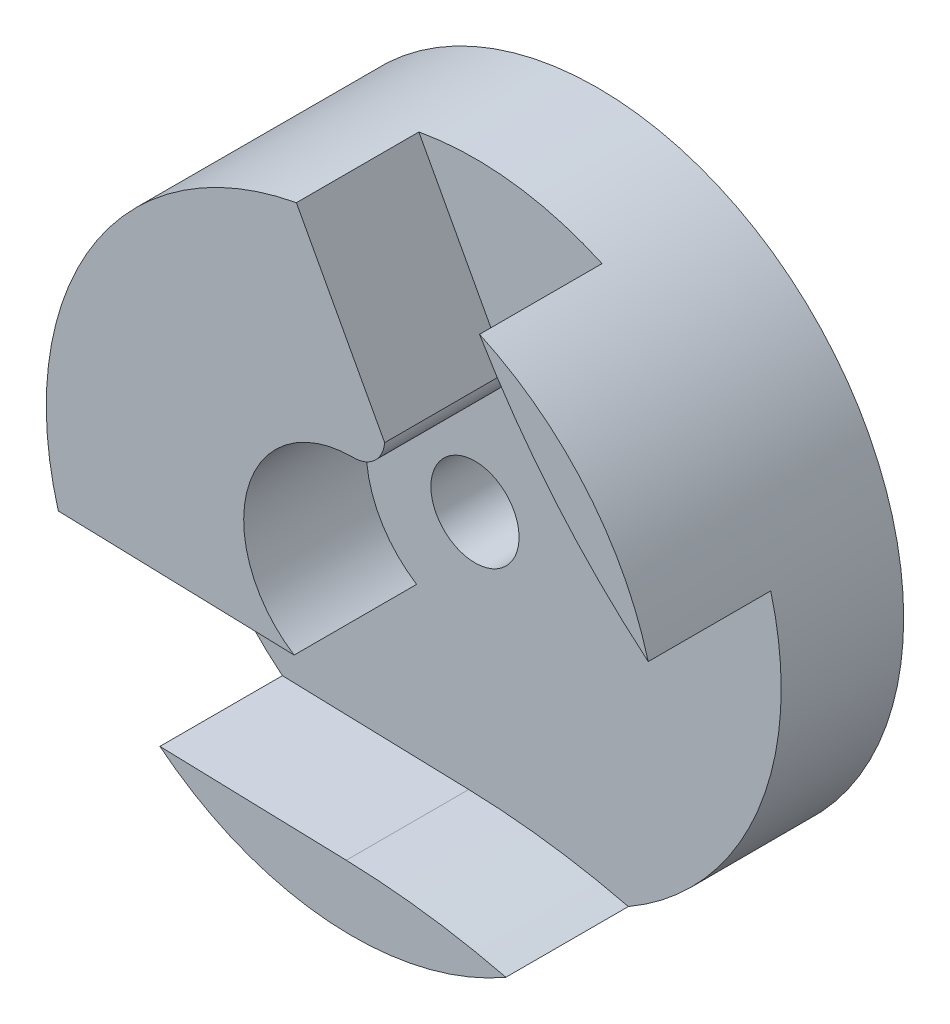
ISO-10303-21;
HEADER;
FILE_DESCRIPTION(('STEP AP214'),'2;1');
FILE_NAME('part.step','',(''),(''),'','','');
FILE_SCHEMA(('AUTOMOTIVE_DESIGN { 1 0 10303 214 1 1 1 1 }'));
ENDSEC;
DATA;
#1=APPLICATION_CONTEXT('core data for automotive mechanical design processes');
#2=APPLICATION_PROTOCOL_DEFINITION('international standard','automotive_design',2000,#1);
#3=PRODUCT_CONTEXT('',#1,'mechanical');
#4=PRODUCT('Part','Part','',(#3));
#5=PRODUCT_RELATED_PRODUCT_CATEGORY('part','',(#4));
#6=PRODUCT_DEFINITION_FORMATION('','',#4);
#7=PRODUCT_DEFINITION_CONTEXT('part definition',#1,'design');
#8=PRODUCT_DEFINITION('design','',#6,#7);
#9=PRODUCT_DEFINITION_SHAPE('','',#8);
#10=(LENGTH_UNIT() NAMED_UNIT(*) SI_UNIT(.MILLI.,.METRE.));
#11=(NAMED_UNIT(*) PLANE_ANGLE_UNIT() SI_UNIT($,.RADIAN.));
#12=(NAMED_UNIT(*) SI_UNIT($,.STERADIAN.) SOLID_ANGLE_UNIT());
#13=UNCERTAINTY_MEASURE_WITH_UNIT(LENGTH_MEASURE(1.E-05),#10,'distance_accuracy_value','');
#14=(GEOMETRIC_REPRESENTATION_CONTEXT(3) GLOBAL_UNCERTAINTY_ASSIGNED_CONTEXT((#13)) GLOBAL_UNIT_ASSIGNED_CONTEXT((#10,
#11,#12)) REPRESENTATION_CONTEXT('',''));
#15=CARTESIAN_POINT('',(0.,0.,0.));
#16=DIRECTION('',(0.,0.,1.));
#17=DIRECTION('',(1.,0.,0.));
#18=AXIS2_PLACEMENT_3D('',#15,#16,#17);
#19=CARTESIAN_POINT('',(-0.424832658778679,-9.62119595117413E-11,6.));
#20=DIRECTION('',(0.,0.,1.));
#21=DIRECTION('',(1.,0.,0.));
#22=AXIS2_PLACEMENT_3D('',#19,#20,#21);
#23=PLANE('',#22);
#24=CARTESIAN_POINT('',(-0.424832658778679,-9.62119595117413E-11,6.));
#25=DIRECTION('',(0.,0.,-1.));
#26=DIRECTION('',(-1.,0.,0.));
#27=AXIS2_PLACEMENT_3D('',#24,#25,#26);
#28=CIRCLE('',#27,2.15900000001489);
#29=CARTESIAN_POINT('',(-2.58383265879357,-9.62119595117413E-11,6.));
#30=VERTEX_POINT('',#29);
#31=EDGE_CURVE('E219',#30,#30,#28,.T.);
#32=ORIENTED_EDGE('',*,*,#31,.T.);
#33=EDGE_LOOP('',(#32));
#34=FACE_BOUND('',#33,.T.);
#35=DIRECTION('',(0.999579707189387,-0.0289898081259671,0.));
#36=VECTOR('',#35,1.);
#37=CARTESIAN_POINT('',(-0.346205444125785,-11.9372965479081,6.));
#38=LINE('',#37,#36);
#39=CARTESIAN_POINT('',(-9.85944441264087,-11.6613936155355,6.));
#40=VERTEX_POINT('',#39);
#41=CARTESIAN_POINT('',(-0.730311074451631,-11.9261567173942,6.));
#42=VERTEX_POINT('',#41);
#43=EDGE_CURVE('E60',#40,#42,#38,.T.);
#44=ORIENTED_EDGE('',*,*,#43,.T.);
#45=CARTESIAN_POINT('',(-1.82032785998803,-49.5103537077151,6.));
#46=DIRECTION('',(0.,0.,1.));
#47=DIRECTION('',(1.,0.,0.));
#48=AXIS2_PLACEMENT_3D('',#45,#46,#47);
#49=CIRCLE('',#48,37.6);
#50=CARTESIAN_POINT('',(7.09052015175933,-12.9815050027321,6.));
#51=VERTEX_POINT('',#50);
#52=EDGE_CURVE('E238',#51,#42,#49,.T.);
#53=ORIENTED_EDGE('',*,*,#52,.F.);
#54=CARTESIAN_POINT('',(-0.424832658778679,-9.62119595117413E-11,6.));
#55=DIRECTION('',(0.,0.,1.));
#56=DIRECTION('',(1.,0.,0.));
#57=AXIS2_PLACEMENT_3D('',#54,#55,#56);
#58=CIRCLE('',#57,15.0000000000107);
#59=CARTESIAN_POINT('',(14.0606908316208,3.8948182510428,6.));
#60=VERTEX_POINT('',#59);
#61=EDGE_CURVE('E53',#51,#60,#58,.T.);
#62=ORIENTED_EDGE('',*,*,#61,.T.);
#63=CARTESIAN_POINT('',(38.2023029240992,32.7208926555867,6.));
#64=DIRECTION('',(0.,0.,1.));
#65=DIRECTION('',(1.,0.,0.));
#66=AXIS2_PLACEMENT_3D('',#63,#64,#65);
#67=CIRCLE('',#66,37.6);
#68=CARTESIAN_POINT('',(5.79889159514122,13.6479030040833,6.));
#69=VERTEX_POINT('',#68);
#70=EDGE_CURVE('E143',#69,#60,#67,.T.);
#71=ORIENTED_EDGE('',*,*,#70,.F.);
#72=CARTESIAN_POINT('',(-3.17395166736761,14.7459263755825,6.));
#73=VERTEX_POINT('',#72);
#74=EDGE_CURVE('E54',#69,#73,#58,.T.);
#75=ORIENTED_EDGE('',*,*,#74,.T.);
#76=DIRECTION('',(0.474683943305985,-0.880156323596826,0.));
#77=VECTOR('',#76,1.);
#78=CARTESIAN_POINT('',(3.70200865666334,1.9965590431897,6.));
#79=LINE('',#78,#77);
#80=CARTESIAN_POINT('',(1.15065730337769,6.72726051093276,6.));
#81=VERTEX_POINT('',#80);
#82=EDGE_CURVE('E194',#73,#81,#79,.T.);
#83=ORIENTED_EDGE('',*,*,#82,.T.);
#84=CARTESIAN_POINT('',(-0.371756847908193,6.85779461302179,6.));
#85=DIRECTION('',(0.,0.,1.));
#86=DIRECTION('',(1.,0.,0.));
#87=AXIS2_PLACEMENT_3D('',#84,#85,#86);
#88=CIRCLE('',#87,1.52799999994885);
#89=CARTESIAN_POINT('',(-0.383582429555104,5.32984037435419,6.));
#90=VERTEX_POINT('',#89);
#91=EDGE_CURVE('E190',#90,#81,#88,.T.);
#92=ORIENTED_EDGE('',*,*,#91,.F.);
#93=CARTESIAN_POINT('',(-0.424832658730439,-9.62119595117413E-11,6.));
#94=DIRECTION('',(0.,0.,1.));
#95=DIRECTION('',(1.,0.,0.));
#96=AXIS2_PLACEMENT_3D('',#93,#94,#95);
#97=CIRCLE('',#96,5.32999999986197);
#98=CARTESIAN_POINT('',(-3.28272132782271,-4.49904127058963,6.));
#99=VERTEX_POINT('',#98);
#100=EDGE_CURVE('E167',#90,#99,#97,.T.);
#101=ORIENTED_EDGE('',*,*,#100,.T.);
#102=DIRECTION('',(-0.999579707189526,0.02898980812115,0.));
#103=VECTOR('',#102,1.);
#104=CARTESIAN_POINT('',(-0.133130354375202,-4.59038569997693,6.));
#105=LINE('',#104,#103);
#106=CARTESIAN_POINT('',(-14.8352856491735,-4.1639938295758,6.));
#107=VERTEX_POINT('',#106);
#108=EDGE_CURVE('E173',#99,#107,#105,.T.);
#109=ORIENTED_EDGE('',*,*,#108,.T.);
#110=EDGE_CURVE('E11',#107,#40,#58,.T.);
#111=ORIENTED_EDGE('',*,*,#110,.T.);
#112=EDGE_LOOP('',(#44,#53,#62,#71,#75,#83,#92,#101,#109,#111));
#113=FACE_BOUND('',#112,.T.);
#114=ADVANCED_FACE('F43',(#34,#113),#23,.T.);
#115=CARTESIAN_POINT('',(-0.424832658778679,-9.62119595117413E-11,6.));
#116=DIRECTION('',(0.,0.,-1.));
#117=DIRECTION('',(-1.,0.,0.));
#118=AXIS2_PLACEMENT_3D('',#115,#116,#117);
#119=CYLINDRICAL_SURFACE('',#118,15.0000000000107);
#120=ORIENTED_EDGE('',*,*,#110,.F.);
#121=DIRECTION('',(0.,0.,-1.));
#122=VECTOR('',#121,1.);
#123=CARTESIAN_POINT('',(-14.8352856491735,-4.1639938295758,12.));
#124=LINE('',#123,#122);
#125=CARTESIAN_POINT('',(-14.8352856491735,-4.1639938295758,12.));
#126=VERTEX_POINT('',#125);
#127=EDGE_CURVE('E202',#126,#107,#124,.T.);
#128=ORIENTED_EDGE('',*,*,#127,.F.);
#129=CARTESIAN_POINT('',(-0.424832658778679,-9.62119595117413E-11,12.));
#130=DIRECTION('',(0.,0.,1.));
#131=DIRECTION('',(1.,0.,0.));
#132=AXIS2_PLACEMENT_3D('',#129,#130,#131);
#133=CIRCLE('',#132,15.0000000000107);
#134=CARTESIAN_POINT('',(-3.17395166736761,14.7459263755825,12.));
#135=VERTEX_POINT('',#134);
#136=EDGE_CURVE('E180',#135,#126,#133,.T.);
#137=ORIENTED_EDGE('',*,*,#136,.F.);
#138=DIRECTION('',(0.,0.,-1.));
#139=VECTOR('',#138,1.);
#140=CARTESIAN_POINT('',(-3.17395166736761,14.7459263755825,12.));
#141=LINE('',#140,#139);
#142=EDGE_CURVE('E206',#135,#73,#141,.T.);
#143=ORIENTED_EDGE('',*,*,#142,.T.);
#144=ORIENTED_EDGE('',*,*,#74,.F.);
#145=DIRECTION('',(0.,0.,-1.));
#146=VECTOR('',#145,1.);
#147=CARTESIAN_POINT('',(5.79889159514122,13.6479030040833,12.));
#148=LINE('',#147,#146);
#149=CARTESIAN_POINT('',(5.79889159514122,13.6479030040833,12.));
#150=VERTEX_POINT('',#149);
#151=EDGE_CURVE('E163',#150,#69,#148,.T.);
#152=ORIENTED_EDGE('',*,*,#151,.F.);
#153=CARTESIAN_POINT('',(-0.424832658778679,-9.62119595117413E-11,12.));
#154=DIRECTION('',(0.,0.,1.));
#155=DIRECTION('',(1.,0.,0.));
#156=AXIS2_PLACEMENT_3D('',#153,#154,#155);
#157=CIRCLE('',#156,15.0000000000107);
#158=CARTESIAN_POINT('',(14.0606908316208,3.8948182510428,12.));
#159=VERTEX_POINT('',#158);
#160=EDGE_CURVE('E148',#159,#150,#157,.T.);
#161=ORIENTED_EDGE('',*,*,#160,.F.);
#162=DIRECTION('',(0.,0.,-1.));
#163=VECTOR('',#162,1.);
#164=CARTESIAN_POINT('',(14.0606908316208,3.8948182510428,12.));
#165=LINE('',#164,#163);
#166=EDGE_CURVE('E159',#159,#60,#165,.T.);
#167=ORIENTED_EDGE('',*,*,#166,.T.);
#168=ORIENTED_EDGE('',*,*,#61,.F.);
#169=DIRECTION('',(0.,0.,-1.));
#170=VECTOR('',#169,1.);
#171=CARTESIAN_POINT('',(7.09052015175933,-12.9815050027321,12.));
#172=LINE('',#171,#170);
#173=CARTESIAN_POINT('',(7.09052015175933,-12.9815050027321,12.));
#174=VERTEX_POINT('',#173);
#175=EDGE_CURVE('E126',#174,#51,#172,.T.);
#176=ORIENTED_EDGE('',*,*,#175,.F.);
#177=CARTESIAN_POINT('',(-0.424832658778679,-9.62119595117413E-11,12.));
#178=DIRECTION('',(0.,0.,1.));
#179=DIRECTION('',(1.,0.,0.));
#180=AXIS2_PLACEMENT_3D('',#177,#178,#179);
#181=CIRCLE('',#180,15.0000000000107);
#182=CARTESIAN_POINT('',(-9.85944441264088,-11.6613936155355,12.));
#183=VERTEX_POINT('',#182);
#184=EDGE_CURVE('E133',#183,#174,#181,.T.);
#185=ORIENTED_EDGE('',*,*,#184,.F.);
#186=DIRECTION('',(0.,0.,-1.));
#187=VECTOR('',#186,1.);
#188=CARTESIAN_POINT('',(-9.85944441264088,-11.6613936155355,12.));
#189=LINE('',#188,#187);
#190=EDGE_CURVE('E150',#183,#40,#189,.T.);
#191=ORIENTED_EDGE('',*,*,#190,.T.);
#192=EDGE_LOOP('',(#120,#128,#137,#143,#144,#152,#161,#167,#168,#176,#185,#191));
#193=FACE_BOUND('',#192,.T.);
#194=CARTESIAN_POINT('',(-0.424832658778679,-9.62119595117413E-11,0.));
#195=DIRECTION('',(0.,0.,1.));
#196=DIRECTION('',(1.,0.,0.));
#197=AXIS2_PLACEMENT_3D('',#194,#195,#196);
#198=CIRCLE('',#197,15.0000000000107);
#199=CARTESIAN_POINT('',(14.575167341232,-9.62119595117413E-11,0.));
#200=VERTEX_POINT('',#199);
#201=EDGE_CURVE('E47',#200,#200,#198,.T.);
#202=ORIENTED_EDGE('',*,*,#201,.T.);
#203=EDGE_LOOP('',(#202));
#204=FACE_BOUND('',#203,.T.);
#205=ADVANCED_FACE('F45',(#193,#204),#119,.T.);
#206=CARTESIAN_POINT('',(-0.424832658778679,-9.62119595117413E-11,0.));
#207=DIRECTION('',(0.,0.,1.));
#208=DIRECTION('',(1.,0.,0.));
#209=AXIS2_PLACEMENT_3D('',#206,#207,#208);
#210=PLANE('',#209);
#211=CARTESIAN_POINT('',(-0.424832658778679,-9.62119595117413E-11,0.));
#212=DIRECTION('',(0.,0.,-1.));
#213=DIRECTION('',(-1.,0.,0.));
#214=AXIS2_PLACEMENT_3D('',#211,#212,#213);
#215=CIRCLE('',#214,2.15900000001489);
#216=CARTESIAN_POINT('',(-2.58383265879357,-9.62119595117413E-11,0.));
#217=VERTEX_POINT('',#216);
#218=EDGE_CURVE('E218',#217,#217,#215,.T.);
#219=ORIENTED_EDGE('',*,*,#218,.F.);
#220=EDGE_LOOP('',(#219));
#221=FACE_BOUND('',#220,.T.);
#222=ORIENTED_EDGE('',*,*,#201,.F.);
#223=EDGE_LOOP('',(#222));
#224=FACE_BOUND('',#223,.T.);
#225=ADVANCED_FACE('F229',(#221,#224),#210,.F.);
#226=CARTESIAN_POINT('',(-0.424832658778679,-9.62119595117413E-11,6.));
#227=DIRECTION('',(0.,0.,-1.));
#228=DIRECTION('',(-1.,0.,0.));
#229=AXIS2_PLACEMENT_3D('',#226,#227,#228);
#230=CYLINDRICAL_SURFACE('',#229,2.15900000001489);
#231=ORIENTED_EDGE('',*,*,#31,.F.);
#232=EDGE_LOOP('',(#231));
#233=FACE_BOUND('',#232,.T.);
#234=ORIENTED_EDGE('',*,*,#218,.T.);
#235=EDGE_LOOP('',(#234));
#236=FACE_BOUND('',#235,.T.);
#237=ADVANCED_FACE('F227',(#233,#236),#230,.F.);
#238=CARTESIAN_POINT('',(-0.424832658730439,-9.62119595117413E-11,12.));
#239=DIRECTION('',(0.,0.,-1.));
#240=DIRECTION('',(-1.,0.,0.));
#241=AXIS2_PLACEMENT_3D('',#238,#239,#240);
#242=CYLINDRICAL_SURFACE('',#241,5.32999999986197);
#243=ORIENTED_EDGE('',*,*,#100,.F.);
#244=DIRECTION('',(0.,0.,-1.));
#245=VECTOR('',#244,1.);
#246=CARTESIAN_POINT('',(-0.383582429555104,5.32984037435419,12.));
#247=LINE('',#246,#245);
#248=CARTESIAN_POINT('',(-0.383582429555104,5.32984037435419,12.));
#249=VERTEX_POINT('',#248);
#250=EDGE_CURVE('E214',#249,#90,#247,.T.);
#251=ORIENTED_EDGE('',*,*,#250,.F.);
#252=CARTESIAN_POINT('',(-0.424832658730439,-9.62119595117413E-11,12.));
#253=DIRECTION('',(0.,0.,1.));
#254=DIRECTION('',(1.,0.,0.));
#255=AXIS2_PLACEMENT_3D('',#252,#253,#254);
#256=CIRCLE('',#255,5.32999999986197);
#257=CARTESIAN_POINT('',(-3.28272132782271,-4.49904127058963,12.));
#258=VERTEX_POINT('',#257);
#259=EDGE_CURVE('E168',#249,#258,#256,.T.);
#260=ORIENTED_EDGE('',*,*,#259,.T.);
#261=DIRECTION('',(0.,0.,-1.));
#262=VECTOR('',#261,1.);
#263=CARTESIAN_POINT('',(-3.28272132782271,-4.49904127058963,12.));
#264=LINE('',#263,#262);
#265=EDGE_CURVE('E187',#258,#99,#264,.T.);
#266=ORIENTED_EDGE('',*,*,#265,.T.);
#267=EDGE_LOOP('',(#243,#251,#260,#266));
#268=FACE_BOUND('',#267,.T.);
#269=ADVANCED_FACE('F265',(#268),#242,.F.);
#270=CARTESIAN_POINT('',(-0.371756847908193,6.85779461302179,12.));
#271=DIRECTION('',(0.,0.,-1.));
#272=DIRECTION('',(-1.,0.,0.));
#273=AXIS2_PLACEMENT_3D('',#270,#271,#272);
#274=CYLINDRICAL_SURFACE('',#273,1.52799999994885);
#275=ORIENTED_EDGE('',*,*,#91,.T.);
#276=DIRECTION('',(0.,0.,-1.));
#277=VECTOR('',#276,1.);
#278=CARTESIAN_POINT('',(1.15065730337769,6.72726051093276,12.));
#279=LINE('',#278,#277);
#280=CARTESIAN_POINT('',(1.15065730337769,6.72726051093276,12.));
#281=VERTEX_POINT('',#280);
#282=EDGE_CURVE('E210',#281,#81,#279,.T.);
#283=ORIENTED_EDGE('',*,*,#282,.F.);
#284=CARTESIAN_POINT('',(-0.371756847908193,6.85779461302179,12.));
#285=DIRECTION('',(0.,0.,1.));
#286=DIRECTION('',(1.,0.,0.));
#287=AXIS2_PLACEMENT_3D('',#284,#285,#286);
#288=CIRCLE('',#287,1.52799999994885);
#289=EDGE_CURVE('E172',#249,#281,#288,.T.);
#290=ORIENTED_EDGE('',*,*,#289,.F.);
#291=ORIENTED_EDGE('',*,*,#250,.T.);
#292=EDGE_LOOP('',(#275,#283,#290,#291));
#293=FACE_BOUND('',#292,.T.);
#294=ADVANCED_FACE('F269',(#293),#274,.T.);
#295=CARTESIAN_POINT('',(3.70200865666334,1.9965590431897,12.));
#296=DIRECTION('',(0.880156323596826,0.474683943305985,0.));
#297=DIRECTION('',(-0.474683943305985,0.880156323596826,0.));
#298=AXIS2_PLACEMENT_3D('',#295,#296,#297);
#299=PLANE('',#298);
#300=ORIENTED_EDGE('',*,*,#82,.F.);
#301=ORIENTED_EDGE('',*,*,#142,.F.);
#302=DIRECTION('',(0.474683943305985,-0.880156323596826,0.));
#303=VECTOR('',#302,1.);
#304=CARTESIAN_POINT('',(3.70200865666334,1.9965590431897,12.));
#305=LINE('',#304,#303);
#306=EDGE_CURVE('E176',#135,#281,#305,.T.);
#307=ORIENTED_EDGE('',*,*,#306,.T.);
#308=ORIENTED_EDGE('',*,*,#282,.T.);
#309=EDGE_LOOP('',(#300,#301,#307,#308));
#310=FACE_BOUND('',#309,.T.);
#311=ADVANCED_FACE('F273',(#310),#299,.T.);
#312=CARTESIAN_POINT('',(-0.133130354375202,-4.59038569997693,12.));
#313=DIRECTION('',(-0.02898980812115,-0.999579707189526,0.));
#314=DIRECTION('',(0.999579707189526,-0.02898980812115,0.));
#315=AXIS2_PLACEMENT_3D('',#312,#313,#314);
#316=PLANE('',#315);
#317=ORIENTED_EDGE('',*,*,#108,.F.);
#318=ORIENTED_EDGE('',*,*,#265,.F.);
#319=DIRECTION('',(-0.999579707189526,0.02898980812115,0.));
#320=VECTOR('',#319,1.);
#321=CARTESIAN_POINT('',(-0.133130354375202,-4.59038569997693,12.));
#322=LINE('',#321,#320);
#323=EDGE_CURVE('E183',#258,#126,#322,.T.);
#324=ORIENTED_EDGE('',*,*,#323,.T.);
#325=ORIENTED_EDGE('',*,*,#127,.T.);
#326=EDGE_LOOP('',(#317,#318,#324,#325));
#327=FACE_BOUND('',#326,.T.);
#328=ADVANCED_FACE('F277',(#327),#316,.T.);
#329=CARTESIAN_POINT('',(0.,0.,12.));
#330=DIRECTION('',(0.,0.,1.));
#331=DIRECTION('',(1.,0.,0.));
#332=AXIS2_PLACEMENT_3D('',#329,#330,#331);
#333=PLANE('',#332);
#334=ORIENTED_EDGE('',*,*,#259,.F.);
#335=ORIENTED_EDGE('',*,*,#289,.T.);
#336=ORIENTED_EDGE('',*,*,#306,.F.);
#337=ORIENTED_EDGE('',*,*,#136,.T.);
#338=ORIENTED_EDGE('',*,*,#323,.F.);
#339=EDGE_LOOP('',(#334,#335,#336,#337,#338));
#340=FACE_BOUND('',#339,.T.);
#341=ADVANCED_FACE('F254',(#340),#333,.T.);
#342=CARTESIAN_POINT('',(38.2023029240992,32.7208926555867,12.));
#343=DIRECTION('',(0.,0.,-1.));
#344=DIRECTION('',(-1.,0.,0.));
#345=AXIS2_PLACEMENT_3D('',#342,#343,#344);
#346=CYLINDRICAL_SURFACE('',#345,37.6);
#347=ORIENTED_EDGE('',*,*,#70,.T.);
#348=ORIENTED_EDGE('',*,*,#166,.F.);
#349=CARTESIAN_POINT('',(38.2023029240992,32.7208926555867,12.));
#350=DIRECTION('',(0.,0.,1.));
#351=DIRECTION('',(1.,0.,0.));
#352=AXIS2_PLACEMENT_3D('',#349,#350,#351);
#353=CIRCLE('',#352,37.6);
#354=EDGE_CURVE('E157',#150,#159,#353,.T.);
#355=ORIENTED_EDGE('',*,*,#354,.F.);
#356=ORIENTED_EDGE('',*,*,#151,.T.);
#357=EDGE_LOOP('',(#347,#348,#355,#356));
#358=FACE_BOUND('',#357,.T.);
#359=ADVANCED_FACE('F241',(#358),#346,.T.);
#360=CARTESIAN_POINT('',(0.,0.,12.));
#361=DIRECTION('',(0.,0.,1.));
#362=DIRECTION('',(1.,0.,0.));
#363=AXIS2_PLACEMENT_3D('',#360,#361,#362);
#364=PLANE('',#363);
#365=ORIENTED_EDGE('',*,*,#160,.T.);
#366=ORIENTED_EDGE('',*,*,#354,.T.);
#367=EDGE_LOOP('',(#365,#366));
#368=FACE_BOUND('',#367,.T.);
#369=ADVANCED_FACE('F245',(#368),#364,.T.);
#370=CARTESIAN_POINT('',(-1.82032785998803,-49.5103537077151,12.));
#371=DIRECTION('',(0.,0.,-1.));
#372=DIRECTION('',(-1.,0.,0.));
#373=AXIS2_PLACEMENT_3D('',#370,#371,#372);
#374=CYLINDRICAL_SURFACE('',#373,37.6);
#375=ORIENTED_EDGE('',*,*,#52,.T.);
#376=DIRECTION('',(0.,0.,-1.));
#377=VECTOR('',#376,1.);
#378=CARTESIAN_POINT('',(-0.730311074451631,-11.9261567173942,12.));
#379=LINE('',#378,#377);
#380=CARTESIAN_POINT('',(-0.730311074451631,-11.9261567173942,12.));
#381=VERTEX_POINT('',#380);
#382=EDGE_CURVE('E127',#381,#42,#379,.T.);
#383=ORIENTED_EDGE('',*,*,#382,.F.);
#384=CARTESIAN_POINT('',(-1.82032785998803,-49.5103537077151,12.));
#385=DIRECTION('',(0.,0.,1.));
#386=DIRECTION('',(1.,0.,0.));
#387=AXIS2_PLACEMENT_3D('',#384,#385,#386);
#388=CIRCLE('',#387,37.6);
#389=EDGE_CURVE('E121',#174,#381,#388,.T.);
#390=ORIENTED_EDGE('',*,*,#389,.F.);
#391=ORIENTED_EDGE('',*,*,#175,.T.);
#392=EDGE_LOOP('',(#375,#383,#390,#391));
#393=FACE_BOUND('',#392,.T.);
#394=ADVANCED_FACE('F124',(#393),#374,.T.);
#395=CARTESIAN_POINT('',(-0.346205444125785,-11.9372965479081,12.));
#396=DIRECTION('',(0.0289898081259671,0.999579707189386,0.));
#397=DIRECTION('',(-0.999579707189387,0.0289898081259671,0.));
#398=AXIS2_PLACEMENT_3D('',#395,#396,#397);
#399=PLANE('',#398);
#400=ORIENTED_EDGE('',*,*,#43,.F.);
#401=ORIENTED_EDGE('',*,*,#190,.F.);
#402=DIRECTION('',(0.999579707189387,-0.0289898081259671,0.));
#403=VECTOR('',#402,1.);
#404=CARTESIAN_POINT('',(-0.346205444125785,-11.9372965479081,12.));
#405=LINE('',#404,#403);
#406=EDGE_CURVE('E132',#183,#381,#405,.T.);
#407=ORIENTED_EDGE('',*,*,#406,.T.);
#408=ORIENTED_EDGE('',*,*,#382,.T.);
#409=EDGE_LOOP('',(#400,#401,#407,#408));
#410=FACE_BOUND('',#409,.T.);
#411=ADVANCED_FACE('F252',(#410),#399,.T.);
#412=CARTESIAN_POINT('',(0.,0.,12.));
#413=DIRECTION('',(0.,0.,1.));
#414=DIRECTION('',(1.,0.,0.));
#415=AXIS2_PLACEMENT_3D('',#412,#413,#414);
#416=PLANE('',#415);
#417=ORIENTED_EDGE('',*,*,#184,.T.);
#418=ORIENTED_EDGE('',*,*,#389,.T.);
#419=ORIENTED_EDGE('',*,*,#406,.F.);
#420=EDGE_LOOP('',(#417,#418,#419));
#421=FACE_BOUND('',#420,.T.);
#422=ADVANCED_FACE('F136',(#421),#416,.T.);
#423=CLOSED_SHELL('',(#114,#205,#225,#237,#269,#294,#311,#328,#341,#359,#369,#394,#411,#422));
#424=MANIFOLD_SOLID_BREP('B2',#423);
#425=ADVANCED_BREP_SHAPE_REPRESENTATION('',(#18,#424),#14);
#426=SHAPE_DEFINITION_REPRESENTATION(#9,#425);
ENDSEC;
END-ISO-10303-21;
